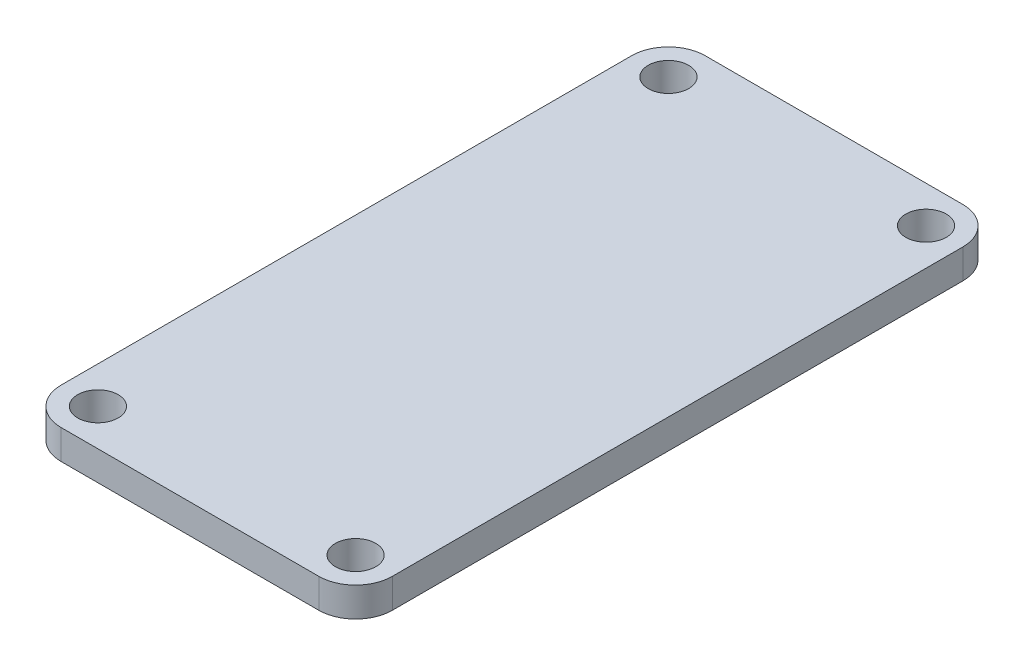
ISO-10303-21;
HEADER;
FILE_DESCRIPTION(('STEP AP214'),'2;1');
FILE_NAME('part.step','',(''),(''),'','','');
FILE_SCHEMA(('AUTOMOTIVE_DESIGN { 1 0 10303 214 1 1 1 1 }'));
ENDSEC;
DATA;
#1=APPLICATION_CONTEXT('core data for automotive mechanical design processes');
#2=APPLICATION_PROTOCOL_DEFINITION('international standard','automotive_design',2000,#1);
#3=PRODUCT_CONTEXT('',#1,'mechanical');
#4=PRODUCT('Part','Part','',(#3));
#5=PRODUCT_RELATED_PRODUCT_CATEGORY('part','',(#4));
#6=PRODUCT_DEFINITION_FORMATION('','',#4);
#7=PRODUCT_DEFINITION_CONTEXT('part definition',#1,'design');
#8=PRODUCT_DEFINITION('design','',#6,#7);
#9=PRODUCT_DEFINITION_SHAPE('','',#8);
#10=(LENGTH_UNIT() NAMED_UNIT(*) SI_UNIT(.MILLI.,.METRE.));
#11=(NAMED_UNIT(*) PLANE_ANGLE_UNIT() SI_UNIT($,.RADIAN.));
#12=(NAMED_UNIT(*) SI_UNIT($,.STERADIAN.) SOLID_ANGLE_UNIT());
#13=UNCERTAINTY_MEASURE_WITH_UNIT(LENGTH_MEASURE(1.E-05),#10,'distance_accuracy_value','');
#14=(GEOMETRIC_REPRESENTATION_CONTEXT(3) GLOBAL_UNCERTAINTY_ASSIGNED_CONTEXT((#13)) GLOBAL_UNIT_ASSIGNED_CONTEXT((#10,
#11,#12)) REPRESENTATION_CONTEXT('',''));
#15=CARTESIAN_POINT('',(0.,0.,0.));
#16=DIRECTION('',(0.,0.,1.));
#17=DIRECTION('',(1.,0.,0.));
#18=AXIS2_PLACEMENT_3D('',#15,#16,#17);
#19=CARTESIAN_POINT('',(9.,1.6,-17.5));
#20=DIRECTION('',(-1.,0.,0.));
#21=DIRECTION('',(0.,0.,1.));
#22=AXIS2_PLACEMENT_3D('',#19,#20,#21);
#23=PLANE('',#22);
#24=DIRECTION('',(0.,0.,-1.));
#25=VECTOR('',#24,1.);
#26=CARTESIAN_POINT('',(9.,0.,-17.5));
#27=LINE('',#26,#25);
#28=CARTESIAN_POINT('',(9.,0.,15.5));
#29=VERTEX_POINT('',#28);
#30=CARTESIAN_POINT('',(9.,0.,-15.5));
#31=VERTEX_POINT('',#30);
#32=EDGE_CURVE('E133',#29,#31,#27,.T.);
#33=ORIENTED_EDGE('',*,*,#32,.T.);
#34=DIRECTION('',(0.,-1.,0.));
#35=VECTOR('',#34,1.);
#36=CARTESIAN_POINT('',(9.,1.6,-15.5));
#37=LINE('',#36,#35);
#38=CARTESIAN_POINT('',(9.,1.6,-15.5));
#39=VERTEX_POINT('',#38);
#40=EDGE_CURVE('E210',#31,#39,#37,.F.);
#41=ORIENTED_EDGE('',*,*,#40,.T.);
#42=DIRECTION('',(0.,0.,-1.));
#43=VECTOR('',#42,1.);
#44=CARTESIAN_POINT('',(9.,1.6,-17.5));
#45=LINE('',#44,#43);
#46=CARTESIAN_POINT('',(9.,1.6,15.5));
#47=VERTEX_POINT('',#46);
#48=EDGE_CURVE('E131',#47,#39,#45,.T.);
#49=ORIENTED_EDGE('',*,*,#48,.F.);
#50=DIRECTION('',(0.,-1.,0.));
#51=VECTOR('',#50,1.);
#52=CARTESIAN_POINT('',(9.,1.6,15.5));
#53=LINE('',#52,#51);
#54=EDGE_CURVE('E212',#47,#29,#53,.T.);
#55=ORIENTED_EDGE('',*,*,#54,.T.);
#56=EDGE_LOOP('',(#33,#41,#49,#55));
#57=FACE_BOUND('',#56,.T.);
#58=ADVANCED_FACE('F38',(#57),#23,.F.);
#59=CARTESIAN_POINT('',(-9.,1.6,-17.5));
#60=DIRECTION('',(0.,0.,1.));
#61=DIRECTION('',(1.,0.,0.));
#62=AXIS2_PLACEMENT_3D('',#59,#60,#61);
#63=PLANE('',#62);
#64=DIRECTION('',(-1.,0.,0.));
#65=VECTOR('',#64,1.);
#66=CARTESIAN_POINT('',(-9.,0.,-17.5));
#67=LINE('',#66,#65);
#68=CARTESIAN_POINT('',(7.,0.,-17.5));
#69=VERTEX_POINT('',#68);
#70=CARTESIAN_POINT('',(-7.,0.,-17.5));
#71=VERTEX_POINT('',#70);
#72=EDGE_CURVE('E129',#69,#71,#67,.T.);
#73=ORIENTED_EDGE('',*,*,#72,.T.);
#74=DIRECTION('',(0.,-1.,0.));
#75=VECTOR('',#74,1.);
#76=CARTESIAN_POINT('',(-7.,1.6,-17.5));
#77=LINE('',#76,#75);
#78=CARTESIAN_POINT('',(-7.,1.6,-17.5));
#79=VERTEX_POINT('',#78);
#80=EDGE_CURVE('E108',#71,#79,#77,.F.);
#81=ORIENTED_EDGE('',*,*,#80,.T.);
#82=DIRECTION('',(-1.,0.,0.));
#83=VECTOR('',#82,1.);
#84=CARTESIAN_POINT('',(-9.,1.6,-17.5));
#85=LINE('',#84,#83);
#86=CARTESIAN_POINT('',(7.,1.6,-17.5));
#87=VERTEX_POINT('',#86);
#88=EDGE_CURVE('E190',#87,#79,#85,.T.);
#89=ORIENTED_EDGE('',*,*,#88,.F.);
#90=DIRECTION('',(0.,-1.,0.));
#91=VECTOR('',#90,1.);
#92=CARTESIAN_POINT('',(7.,1.6,-17.5));
#93=LINE('',#92,#91);
#94=EDGE_CURVE('E113',#87,#69,#93,.T.);
#95=ORIENTED_EDGE('',*,*,#94,.T.);
#96=EDGE_LOOP('',(#73,#81,#89,#95));
#97=FACE_BOUND('',#96,.T.);
#98=ADVANCED_FACE('F224',(#97),#63,.F.);
#99=CARTESIAN_POINT('',(-9.,1.6,-17.5));
#100=DIRECTION('',(1.,0.,0.));
#101=DIRECTION('',(0.,0.,-1.));
#102=AXIS2_PLACEMENT_3D('',#99,#100,#101);
#103=PLANE('',#102);
#104=DIRECTION('',(0.,0.,1.));
#105=VECTOR('',#104,1.);
#106=CARTESIAN_POINT('',(-9.,1.6,-17.5));
#107=LINE('',#106,#105);
#108=CARTESIAN_POINT('',(-9.,1.6,-15.5));
#109=VERTEX_POINT('',#108);
#110=CARTESIAN_POINT('',(-8.99999999999999,1.6,15.5));
#111=VERTEX_POINT('',#110);
#112=EDGE_CURVE('E122',#109,#111,#107,.T.);
#113=ORIENTED_EDGE('',*,*,#112,.F.);
#114=DIRECTION('',(0.,-1.,0.));
#115=VECTOR('',#114,1.);
#116=CARTESIAN_POINT('',(-9.,1.6,-15.5));
#117=LINE('',#116,#115);
#118=CARTESIAN_POINT('',(-9.,0.,-15.5));
#119=VERTEX_POINT('',#118);
#120=EDGE_CURVE('E107',#109,#119,#117,.T.);
#121=ORIENTED_EDGE('',*,*,#120,.T.);
#122=DIRECTION('',(0.,0.,1.));
#123=VECTOR('',#122,1.);
#124=CARTESIAN_POINT('',(-9.,0.,-17.5));
#125=LINE('',#124,#123);
#126=CARTESIAN_POINT('',(-8.99999999999999,0.,15.5));
#127=VERTEX_POINT('',#126);
#128=EDGE_CURVE('E120',#119,#127,#125,.T.);
#129=ORIENTED_EDGE('',*,*,#128,.T.);
#130=DIRECTION('',(0.,-1.,0.));
#131=VECTOR('',#130,1.);
#132=CARTESIAN_POINT('',(-8.99999999999999,1.6,15.5));
#133=LINE('',#132,#131);
#134=EDGE_CURVE('E124',#127,#111,#133,.F.);
#135=ORIENTED_EDGE('',*,*,#134,.T.);
#136=EDGE_LOOP('',(#113,#121,#129,#135));
#137=FACE_BOUND('',#136,.T.);
#138=ADVANCED_FACE('F119',(#137),#103,.F.);
#139=CARTESIAN_POINT('',(-8.99999999999999,1.6,17.5));
#140=DIRECTION('',(0.,0.,-1.));
#141=DIRECTION('',(-1.,0.,0.));
#142=AXIS2_PLACEMENT_3D('',#139,#140,#141);
#143=PLANE('',#142);
#144=DIRECTION('',(1.,0.,0.));
#145=VECTOR('',#144,1.);
#146=CARTESIAN_POINT('',(-8.99999999999999,0.,17.5));
#147=LINE('',#146,#145);
#148=CARTESIAN_POINT('',(-6.99999999999999,0.,17.5));
#149=VERTEX_POINT('',#148);
#150=CARTESIAN_POINT('',(7.,0.,17.5));
#151=VERTEX_POINT('',#150);
#152=EDGE_CURVE('E128',#149,#151,#147,.T.);
#153=ORIENTED_EDGE('',*,*,#152,.T.);
#154=DIRECTION('',(0.,-1.,0.));
#155=VECTOR('',#154,1.);
#156=CARTESIAN_POINT('',(7.,1.6,17.5));
#157=LINE('',#156,#155);
#158=CARTESIAN_POINT('',(7.,1.6,17.5));
#159=VERTEX_POINT('',#158);
#160=EDGE_CURVE('E12',#151,#159,#157,.F.);
#161=ORIENTED_EDGE('',*,*,#160,.T.);
#162=DIRECTION('',(1.,0.,0.));
#163=VECTOR('',#162,1.);
#164=CARTESIAN_POINT('',(-8.99999999999999,1.6,17.5));
#165=LINE('',#164,#163);
#166=CARTESIAN_POINT('',(-6.99999999999999,1.6,17.5));
#167=VERTEX_POINT('',#166);
#168=EDGE_CURVE('E137',#167,#159,#165,.T.);
#169=ORIENTED_EDGE('',*,*,#168,.F.);
#170=DIRECTION('',(0.,-1.,0.));
#171=VECTOR('',#170,1.);
#172=CARTESIAN_POINT('',(-6.99999999999999,1.6,17.5));
#173=LINE('',#172,#171);
#174=EDGE_CURVE('E46',#167,#149,#173,.T.);
#175=ORIENTED_EDGE('',*,*,#174,.T.);
#176=EDGE_LOOP('',(#153,#161,#169,#175));
#177=FACE_BOUND('',#176,.T.);
#178=ADVANCED_FACE('F219',(#177),#143,.F.);
#179=CARTESIAN_POINT('',(0.,1.6,0.));
#180=DIRECTION('',(0.,1.,0.));
#181=DIRECTION('',(0.,0.,1.));
#182=AXIS2_PLACEMENT_3D('',#179,#180,#181);
#183=PLANE('',#182);
#184=CARTESIAN_POINT('',(-7.,1.6,15.5));
#185=DIRECTION('',(0.,1.,0.));
#186=DIRECTION('',(0.,0.,-1.));
#187=AXIS2_PLACEMENT_3D('',#184,#185,#186);
#188=CIRCLE('',#187,1.1);
#189=CARTESIAN_POINT('',(-7.,1.6,14.4));
#190=VERTEX_POINT('',#189);
#191=EDGE_CURVE('E178',#190,#190,#188,.T.);
#192=ORIENTED_EDGE('',*,*,#191,.F.);
#193=EDGE_LOOP('',(#192));
#194=FACE_BOUND('',#193,.T.);
#195=CARTESIAN_POINT('',(7.,1.6,15.5));
#196=DIRECTION('',(0.,1.,0.));
#197=DIRECTION('',(0.,0.,1.));
#198=AXIS2_PLACEMENT_3D('',#195,#196,#197);
#199=CIRCLE('',#198,1.1);
#200=CARTESIAN_POINT('',(7.,1.6,16.6));
#201=VERTEX_POINT('',#200);
#202=EDGE_CURVE('E360',#201,#201,#199,.T.);
#203=ORIENTED_EDGE('',*,*,#202,.F.);
#204=EDGE_LOOP('',(#203));
#205=FACE_BOUND('',#204,.T.);
#206=CARTESIAN_POINT('',(7.,1.6,-15.5));
#207=DIRECTION('',(0.,1.,0.));
#208=DIRECTION('',(0.,0.,-1.));
#209=AXIS2_PLACEMENT_3D('',#206,#207,#208);
#210=CIRCLE('',#209,1.1);
#211=CARTESIAN_POINT('',(7.,1.6,-16.6));
#212=VERTEX_POINT('',#211);
#213=EDGE_CURVE('E353',#212,#212,#210,.T.);
#214=ORIENTED_EDGE('',*,*,#213,.F.);
#215=EDGE_LOOP('',(#214));
#216=FACE_BOUND('',#215,.T.);
#217=CARTESIAN_POINT('',(-7.,1.6,-15.5));
#218=DIRECTION('',(0.,1.,0.));
#219=DIRECTION('',(0.,0.,1.));
#220=AXIS2_PLACEMENT_3D('',#217,#218,#219);
#221=CIRCLE('',#220,1.1);
#222=CARTESIAN_POINT('',(-7.,1.6,-14.4));
#223=VERTEX_POINT('',#222);
#224=EDGE_CURVE('E169',#223,#223,#221,.T.);
#225=ORIENTED_EDGE('',*,*,#224,.F.);
#226=EDGE_LOOP('',(#225));
#227=FACE_BOUND('',#226,.T.);
#228=ORIENTED_EDGE('',*,*,#88,.T.);
#229=CARTESIAN_POINT('',(-7.,1.6,-15.5));
#230=DIRECTION('',(0.,1.,0.));
#231=DIRECTION('',(0.,0.,1.));
#232=AXIS2_PLACEMENT_3D('',#229,#230,#231);
#233=CIRCLE('',#232,2.);
#234=EDGE_CURVE('E211',#79,#109,#233,.T.);
#235=ORIENTED_EDGE('',*,*,#234,.T.);
#236=ORIENTED_EDGE('',*,*,#112,.T.);
#237=CARTESIAN_POINT('',(-6.99999999999999,1.6,15.5));
#238=DIRECTION('',(0.,1.,0.));
#239=DIRECTION('',(0.,0.,1.));
#240=AXIS2_PLACEMENT_3D('',#237,#238,#239);
#241=CIRCLE('',#240,2.);
#242=EDGE_CURVE('E58',#111,#167,#241,.T.);
#243=ORIENTED_EDGE('',*,*,#242,.T.);
#244=ORIENTED_EDGE('',*,*,#168,.T.);
#245=CARTESIAN_POINT('',(7.,1.6,15.5));
#246=DIRECTION('',(0.,1.,0.));
#247=DIRECTION('',(0.,0.,1.));
#248=AXIS2_PLACEMENT_3D('',#245,#246,#247);
#249=CIRCLE('',#248,2.);
#250=EDGE_CURVE('E149',#159,#47,#249,.T.);
#251=ORIENTED_EDGE('',*,*,#250,.T.);
#252=ORIENTED_EDGE('',*,*,#48,.T.);
#253=CARTESIAN_POINT('',(7.,1.6,-15.5));
#254=DIRECTION('',(0.,1.,0.));
#255=DIRECTION('',(0.,0.,1.));
#256=AXIS2_PLACEMENT_3D('',#253,#254,#255);
#257=CIRCLE('',#256,2.);
#258=EDGE_CURVE('E204',#39,#87,#257,.T.);
#259=ORIENTED_EDGE('',*,*,#258,.T.);
#260=EDGE_LOOP('',(#228,#235,#236,#243,#244,#251,#252,#259));
#261=FACE_BOUND('',#260,.T.);
#262=ADVANCED_FACE('F203',(#194,#205,#216,#227,#261),#183,.T.);
#263=CARTESIAN_POINT('',(0.,0.,0.));
#264=DIRECTION('',(0.,1.,0.));
#265=DIRECTION('',(0.,0.,1.));
#266=AXIS2_PLACEMENT_3D('',#263,#264,#265);
#267=PLANE('',#266);
#268=CARTESIAN_POINT('',(-7.,0.,15.5));
#269=DIRECTION('',(0.,1.,0.));
#270=DIRECTION('',(0.,0.,-1.));
#271=AXIS2_PLACEMENT_3D('',#268,#269,#270);
#272=CIRCLE('',#271,1.1);
#273=CARTESIAN_POINT('',(-7.,0.,14.4));
#274=VERTEX_POINT('',#273);
#275=EDGE_CURVE('E366',#274,#274,#272,.T.);
#276=ORIENTED_EDGE('',*,*,#275,.T.);
#277=EDGE_LOOP('',(#276));
#278=FACE_BOUND('',#277,.T.);
#279=CARTESIAN_POINT('',(7.,0.,15.5));
#280=DIRECTION('',(0.,1.,0.));
#281=DIRECTION('',(0.,0.,1.));
#282=AXIS2_PLACEMENT_3D('',#279,#280,#281);
#283=CIRCLE('',#282,1.1);
#284=CARTESIAN_POINT('',(7.,0.,16.6));
#285=VERTEX_POINT('',#284);
#286=EDGE_CURVE('E356',#285,#285,#283,.T.);
#287=ORIENTED_EDGE('',*,*,#286,.T.);
#288=EDGE_LOOP('',(#287));
#289=FACE_BOUND('',#288,.T.);
#290=CARTESIAN_POINT('',(7.,0.,-15.5));
#291=DIRECTION('',(0.,1.,0.));
#292=DIRECTION('',(0.,0.,-1.));
#293=AXIS2_PLACEMENT_3D('',#290,#291,#292);
#294=CIRCLE('',#293,1.1);
#295=CARTESIAN_POINT('',(7.,0.,-16.6));
#296=VERTEX_POINT('',#295);
#297=EDGE_CURVE('E175',#296,#296,#294,.T.);
#298=ORIENTED_EDGE('',*,*,#297,.T.);
#299=EDGE_LOOP('',(#298));
#300=FACE_BOUND('',#299,.T.);
#301=CARTESIAN_POINT('',(-7.,0.,-15.5));
#302=DIRECTION('',(0.,1.,0.));
#303=DIRECTION('',(0.,0.,1.));
#304=AXIS2_PLACEMENT_3D('',#301,#302,#303);
#305=CIRCLE('',#304,1.1);
#306=CARTESIAN_POINT('',(-7.,0.,-14.4));
#307=VERTEX_POINT('',#306);
#308=EDGE_CURVE('E163',#307,#307,#305,.T.);
#309=ORIENTED_EDGE('',*,*,#308,.T.);
#310=EDGE_LOOP('',(#309));
#311=FACE_BOUND('',#310,.T.);
#312=ORIENTED_EDGE('',*,*,#128,.F.);
#313=CARTESIAN_POINT('',(-7.,0.,-15.5));
#314=DIRECTION('',(0.,1.,0.));
#315=DIRECTION('',(0.,0.,1.));
#316=AXIS2_PLACEMENT_3D('',#313,#314,#315);
#317=CIRCLE('',#316,2.);
#318=EDGE_CURVE('E103',#119,#71,#317,.F.);
#319=ORIENTED_EDGE('',*,*,#318,.T.);
#320=ORIENTED_EDGE('',*,*,#72,.F.);
#321=CARTESIAN_POINT('',(7.,0.,-15.5));
#322=DIRECTION('',(0.,1.,0.));
#323=DIRECTION('',(0.,0.,1.));
#324=AXIS2_PLACEMENT_3D('',#321,#322,#323);
#325=CIRCLE('',#324,2.);
#326=EDGE_CURVE('E114',#69,#31,#325,.F.);
#327=ORIENTED_EDGE('',*,*,#326,.T.);
#328=ORIENTED_EDGE('',*,*,#32,.F.);
#329=CARTESIAN_POINT('',(7.,0.,15.5));
#330=DIRECTION('',(0.,1.,0.));
#331=DIRECTION('',(0.,0.,1.));
#332=AXIS2_PLACEMENT_3D('',#329,#330,#331);
#333=CIRCLE('',#332,2.);
#334=EDGE_CURVE('E140',#29,#151,#333,.F.);
#335=ORIENTED_EDGE('',*,*,#334,.T.);
#336=ORIENTED_EDGE('',*,*,#152,.F.);
#337=CARTESIAN_POINT('',(-6.99999999999999,0.,15.5));
#338=DIRECTION('',(0.,1.,0.));
#339=DIRECTION('',(0.,0.,1.));
#340=AXIS2_PLACEMENT_3D('',#337,#338,#339);
#341=CIRCLE('',#340,2.);
#342=EDGE_CURVE('E123',#149,#127,#341,.F.);
#343=ORIENTED_EDGE('',*,*,#342,.T.);
#344=EDGE_LOOP('',(#312,#319,#320,#327,#328,#335,#336,#343));
#345=FACE_BOUND('',#344,.T.);
#346=ADVANCED_FACE('F126',(#278,#289,#300,#311,#345),#267,.F.);
#347=CARTESIAN_POINT('',(-7.,0.,-15.5));
#348=DIRECTION('',(0.,1.,0.));
#349=DIRECTION('',(0.,0.,1.));
#350=AXIS2_PLACEMENT_3D('',#347,#348,#349);
#351=CYLINDRICAL_SURFACE('',#350,1.1);
#352=ORIENTED_EDGE('',*,*,#308,.F.);
#353=EDGE_LOOP('',(#352));
#354=FACE_BOUND('',#353,.T.);
#355=ORIENTED_EDGE('',*,*,#224,.T.);
#356=EDGE_LOOP('',(#355));
#357=FACE_BOUND('',#356,.T.);
#358=ADVANCED_FACE('F270',(#354,#357),#351,.F.);
#359=CARTESIAN_POINT('',(7.,0.,-15.5));
#360=DIRECTION('',(0.,1.,0.));
#361=DIRECTION('',(0.,0.,1.));
#362=AXIS2_PLACEMENT_3D('',#359,#360,#361);
#363=CYLINDRICAL_SURFACE('',#362,1.1);
#364=ORIENTED_EDGE('',*,*,#297,.F.);
#365=EDGE_LOOP('',(#364));
#366=FACE_BOUND('',#365,.T.);
#367=ORIENTED_EDGE('',*,*,#213,.T.);
#368=EDGE_LOOP('',(#367));
#369=FACE_BOUND('',#368,.T.);
#370=ADVANCED_FACE('F324',(#366,#369),#363,.F.);
#371=CARTESIAN_POINT('',(7.,0.,15.5));
#372=DIRECTION('',(0.,1.,0.));
#373=DIRECTION('',(0.,0.,1.));
#374=AXIS2_PLACEMENT_3D('',#371,#372,#373);
#375=CYLINDRICAL_SURFACE('',#374,1.1);
#376=ORIENTED_EDGE('',*,*,#286,.F.);
#377=EDGE_LOOP('',(#376));
#378=FACE_BOUND('',#377,.T.);
#379=ORIENTED_EDGE('',*,*,#202,.T.);
#380=EDGE_LOOP('',(#379));
#381=FACE_BOUND('',#380,.T.);
#382=ADVANCED_FACE('F314',(#378,#381),#375,.F.);
#383=CARTESIAN_POINT('',(-7.,0.,15.5));
#384=DIRECTION('',(0.,1.,0.));
#385=DIRECTION('',(0.,0.,1.));
#386=AXIS2_PLACEMENT_3D('',#383,#384,#385);
#387=CYLINDRICAL_SURFACE('',#386,1.1);
#388=ORIENTED_EDGE('',*,*,#275,.F.);
#389=EDGE_LOOP('',(#388));
#390=FACE_BOUND('',#389,.T.);
#391=ORIENTED_EDGE('',*,*,#191,.T.);
#392=EDGE_LOOP('',(#391));
#393=FACE_BOUND('',#392,.T.);
#394=ADVANCED_FACE('F235',(#390,#393),#387,.F.);
#395=CARTESIAN_POINT('',(-7.,1.6,-15.5));
#396=DIRECTION('',(0.,-1.,0.));
#397=DIRECTION('',(0.,0.,-1.));
#398=AXIS2_PLACEMENT_3D('',#395,#396,#397);
#399=CYLINDRICAL_SURFACE('',#398,2.);
#400=ORIENTED_EDGE('',*,*,#234,.F.);
#401=ORIENTED_EDGE('',*,*,#80,.F.);
#402=ORIENTED_EDGE('',*,*,#318,.F.);
#403=ORIENTED_EDGE('',*,*,#120,.F.);
#404=EDGE_LOOP('',(#400,#401,#402,#403));
#405=FACE_BOUND('',#404,.T.);
#406=ADVANCED_FACE('F106',(#405),#399,.T.);
#407=CARTESIAN_POINT('',(7.,1.6,-15.5));
#408=DIRECTION('',(0.,-1.,0.));
#409=DIRECTION('',(0.,0.,-1.));
#410=AXIS2_PLACEMENT_3D('',#407,#408,#409);
#411=CYLINDRICAL_SURFACE('',#410,2.);
#412=ORIENTED_EDGE('',*,*,#258,.F.);
#413=ORIENTED_EDGE('',*,*,#40,.F.);
#414=ORIENTED_EDGE('',*,*,#326,.F.);
#415=ORIENTED_EDGE('',*,*,#94,.F.);
#416=EDGE_LOOP('',(#412,#413,#414,#415));
#417=FACE_BOUND('',#416,.T.);
#418=ADVANCED_FACE('F209',(#417),#411,.T.);
#419=CARTESIAN_POINT('',(7.,1.6,15.5));
#420=DIRECTION('',(0.,-1.,0.));
#421=DIRECTION('',(0.,0.,-1.));
#422=AXIS2_PLACEMENT_3D('',#419,#420,#421);
#423=CYLINDRICAL_SURFACE('',#422,2.);
#424=ORIENTED_EDGE('',*,*,#250,.F.);
#425=ORIENTED_EDGE('',*,*,#160,.F.);
#426=ORIENTED_EDGE('',*,*,#334,.F.);
#427=ORIENTED_EDGE('',*,*,#54,.F.);
#428=EDGE_LOOP('',(#424,#425,#426,#427));
#429=FACE_BOUND('',#428,.T.);
#430=ADVANCED_FACE('F222',(#429),#423,.T.);
#431=CARTESIAN_POINT('',(-6.99999999999999,1.6,15.5));
#432=DIRECTION('',(0.,-1.,0.));
#433=DIRECTION('',(0.,0.,-1.));
#434=AXIS2_PLACEMENT_3D('',#431,#432,#433);
#435=CYLINDRICAL_SURFACE('',#434,2.);
#436=ORIENTED_EDGE('',*,*,#242,.F.);
#437=ORIENTED_EDGE('',*,*,#134,.F.);
#438=ORIENTED_EDGE('',*,*,#342,.F.);
#439=ORIENTED_EDGE('',*,*,#174,.F.);
#440=EDGE_LOOP('',(#436,#437,#438,#439));
#441=FACE_BOUND('',#440,.T.);
#442=ADVANCED_FACE('F40',(#441),#435,.T.);
#443=CLOSED_SHELL('',(#58,#98,#138,#178,#262,#346,#358,#370,#382,#394,#406,#418,#430,#442));
#444=MANIFOLD_SOLID_BREP('B2',#443);
#445=ADVANCED_BREP_SHAPE_REPRESENTATION('',(#18,#444),#14);
#446=SHAPE_DEFINITION_REPRESENTATION(#9,#445);
ENDSEC;
END-ISO-10303-21;
